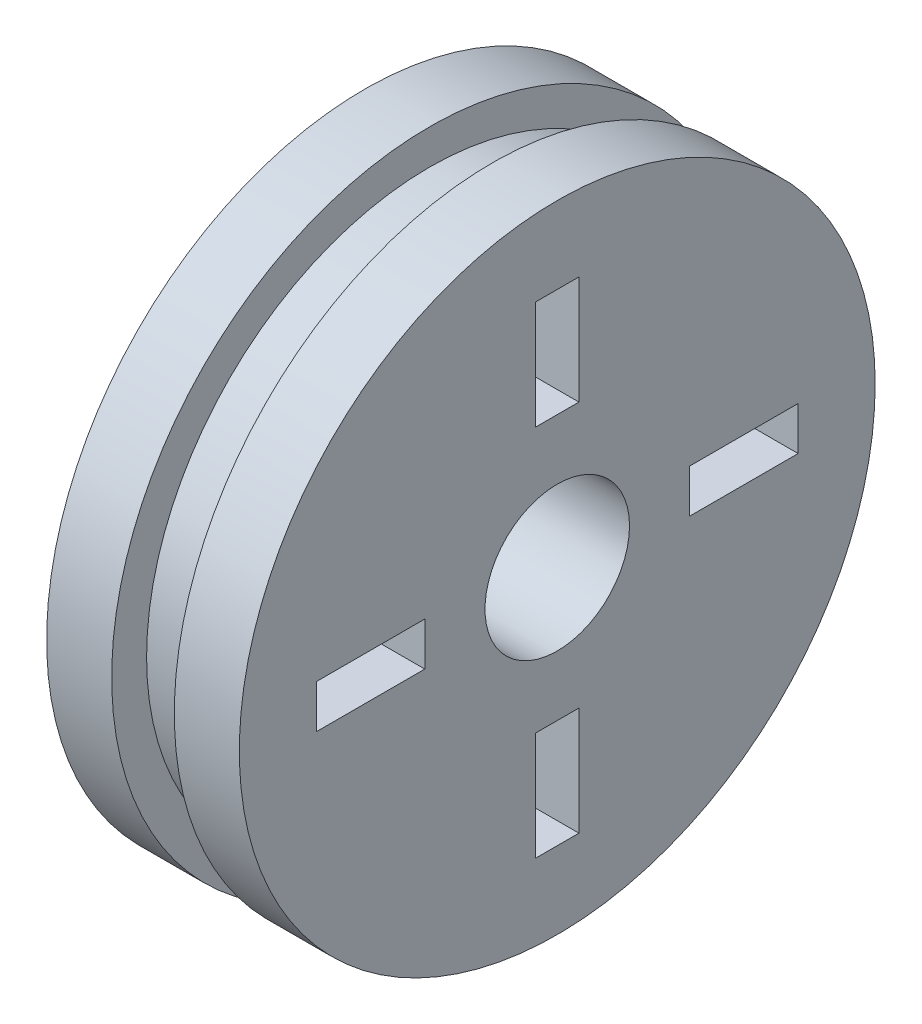
ISO-10303-21;
HEADER;
FILE_DESCRIPTION(('STEP AP214'),'2;1');
FILE_NAME('part.step','',(''),(''),'','','');
FILE_SCHEMA(('AUTOMOTIVE_DESIGN { 1 0 10303 214 1 1 1 1 }'));
ENDSEC;
DATA;
#1=APPLICATION_CONTEXT('core data for automotive mechanical design processes');
#2=APPLICATION_PROTOCOL_DEFINITION('international standard','automotive_design',2000,#1);
#3=PRODUCT_CONTEXT('',#1,'mechanical');
#4=PRODUCT('Part','Part','',(#3));
#5=PRODUCT_RELATED_PRODUCT_CATEGORY('part','',(#4));
#6=PRODUCT_DEFINITION_FORMATION('','',#4);
#7=PRODUCT_DEFINITION_CONTEXT('part definition',#1,'design');
#8=PRODUCT_DEFINITION('design','',#6,#7);
#9=PRODUCT_DEFINITION_SHAPE('','',#8);
#10=(LENGTH_UNIT() NAMED_UNIT(*) SI_UNIT(.MILLI.,.METRE.));
#11=(NAMED_UNIT(*) PLANE_ANGLE_UNIT() SI_UNIT($,.RADIAN.));
#12=(NAMED_UNIT(*) SI_UNIT($,.STERADIAN.) SOLID_ANGLE_UNIT());
#13=UNCERTAINTY_MEASURE_WITH_UNIT(LENGTH_MEASURE(1.E-05),#10,'distance_accuracy_value','');
#14=(GEOMETRIC_REPRESENTATION_CONTEXT(3) GLOBAL_UNCERTAINTY_ASSIGNED_CONTEXT((#13)) GLOBAL_UNIT_ASSIGNED_CONTEXT((#10,
#11,#12)) REPRESENTATION_CONTEXT('',''));
#15=CARTESIAN_POINT('',(0.,0.,0.));
#16=DIRECTION('',(0.,0.,1.));
#17=DIRECTION('',(1.,0.,0.));
#18=AXIS2_PLACEMENT_3D('',#15,#16,#17);
#19=CARTESIAN_POINT('',(85.2,-65.,66.));
#20=DIRECTION('',(1.,0.,0.));
#21=DIRECTION('',(0.,0.,-1.));
#22=AXIS2_PLACEMENT_3D('',#19,#20,#21);
#23=PLANE('',#22);
#24=CARTESIAN_POINT('',(85.2,-65.,66.));
#25=DIRECTION('',(1.,0.,0.));
#26=DIRECTION('',(0.,0.,-1.));
#27=AXIS2_PLACEMENT_3D('',#24,#25,#26);
#28=CIRCLE('',#27,3.);
#29=CARTESIAN_POINT('',(85.2,-65.,63.));
#30=VERTEX_POINT('',#29);
#31=EDGE_CURVE('E936',#30,#30,#28,.F.);
#32=ORIENTED_EDGE('',*,*,#31,.T.);
#33=EDGE_LOOP('',(#32));
#34=FACE_BOUND('',#33,.T.);
#35=CARTESIAN_POINT('',(85.2,-65.,66.));
#36=DIRECTION('',(1.,0.,0.));
#37=DIRECTION('',(0.,0.,-1.));
#38=AXIS2_PLACEMENT_3D('',#35,#36,#37);
#39=CIRCLE('',#38,13.2);
#40=CARTESIAN_POINT('',(85.2,-65.,52.8));
#41=VERTEX_POINT('',#40);
#42=EDGE_CURVE('E386',#41,#41,#39,.T.);
#43=ORIENTED_EDGE('',*,*,#42,.T.);
#44=EDGE_LOOP('',(#43));
#45=FACE_BOUND('',#44,.T.);
#46=DIRECTION('',(0.,0.,1.));
#47=VECTOR('',#46,1.);
#48=CARTESIAN_POINT('',(85.2,-59.5,66.));
#49=LINE('',#48,#47);
#50=CARTESIAN_POINT('',(85.2,-59.5,65.1));
#51=VERTEX_POINT('',#50);
#52=CARTESIAN_POINT('',(85.2,-59.5,66.9));
#53=VERTEX_POINT('',#52);
#54=EDGE_CURVE('E363',#51,#53,#49,.T.);
#55=ORIENTED_EDGE('',*,*,#54,.T.);
#56=DIRECTION('',(0.,1.,0.));
#57=VECTOR('',#56,1.);
#58=CARTESIAN_POINT('',(85.2,-65.,66.9));
#59=LINE('',#58,#57);
#60=CARTESIAN_POINT('',(85.2,-55.,66.9));
#61=VERTEX_POINT('',#60);
#62=EDGE_CURVE('E357',#53,#61,#59,.T.);
#63=ORIENTED_EDGE('',*,*,#62,.T.);
#64=DIRECTION('',(0.,0.,-1.));
#65=VECTOR('',#64,1.);
#66=CARTESIAN_POINT('',(85.2,-55.,66.));
#67=LINE('',#66,#65);
#68=CARTESIAN_POINT('',(85.2,-55.,65.1));
#69=VERTEX_POINT('',#68);
#70=EDGE_CURVE('E360',#61,#69,#67,.T.);
#71=ORIENTED_EDGE('',*,*,#70,.T.);
#72=DIRECTION('',(0.,1.,0.));
#73=VECTOR('',#72,1.);
#74=CARTESIAN_POINT('',(85.2,-65.,65.1));
#75=LINE('',#74,#73);
#76=EDGE_CURVE('E353',#51,#69,#75,.T.);
#77=ORIENTED_EDGE('',*,*,#76,.F.);
#78=EDGE_LOOP('',(#55,#63,#71,#77));
#79=FACE_BOUND('',#78,.T.);
#80=DIRECTION('',(0.,0.,1.));
#81=VECTOR('',#80,1.);
#82=CARTESIAN_POINT('',(85.2,-75.,66.));
#83=LINE('',#82,#81);
#84=CARTESIAN_POINT('',(85.2,-75.,65.1));
#85=VERTEX_POINT('',#84);
#86=CARTESIAN_POINT('',(85.2,-75.,66.9));
#87=VERTEX_POINT('',#86);
#88=EDGE_CURVE('E323',#85,#87,#83,.T.);
#89=ORIENTED_EDGE('',*,*,#88,.T.);
#90=DIRECTION('',(0.,1.,0.));
#91=VECTOR('',#90,1.);
#92=CARTESIAN_POINT('',(85.2,-65.,66.9));
#93=LINE('',#92,#91);
#94=CARTESIAN_POINT('',(85.2,-70.5,66.9));
#95=VERTEX_POINT('',#94);
#96=EDGE_CURVE('E317',#87,#95,#93,.T.);
#97=ORIENTED_EDGE('',*,*,#96,.T.);
#98=DIRECTION('',(0.,0.,-1.));
#99=VECTOR('',#98,1.);
#100=CARTESIAN_POINT('',(85.2,-70.5,66.));
#101=LINE('',#100,#99);
#102=CARTESIAN_POINT('',(85.2,-70.5,65.1));
#103=VERTEX_POINT('',#102);
#104=EDGE_CURVE('E320',#95,#103,#101,.T.);
#105=ORIENTED_EDGE('',*,*,#104,.T.);
#106=DIRECTION('',(0.,1.,0.));
#107=VECTOR('',#106,1.);
#108=CARTESIAN_POINT('',(85.2,-65.,65.1));
#109=LINE('',#108,#107);
#110=EDGE_CURVE('E313',#85,#103,#109,.T.);
#111=ORIENTED_EDGE('',*,*,#110,.F.);
#112=EDGE_LOOP('',(#89,#97,#105,#111));
#113=FACE_BOUND('',#112,.T.);
#114=DIRECTION('',(0.,0.,1.));
#115=VECTOR('',#114,1.);
#116=CARTESIAN_POINT('',(85.2,-65.9,66.));
#117=LINE('',#116,#115);
#118=CARTESIAN_POINT('',(85.2,-65.9,71.5));
#119=VERTEX_POINT('',#118);
#120=CARTESIAN_POINT('',(85.2,-65.9,76.));
#121=VERTEX_POINT('',#120);
#122=EDGE_CURVE('E286',#119,#121,#117,.T.);
#123=ORIENTED_EDGE('',*,*,#122,.T.);
#124=DIRECTION('',(0.,1.,0.));
#125=VECTOR('',#124,1.);
#126=CARTESIAN_POINT('',(85.2,-65.,76.));
#127=LINE('',#126,#125);
#128=CARTESIAN_POINT('',(85.2,-64.1,76.));
#129=VERTEX_POINT('',#128);
#130=EDGE_CURVE('E280',#121,#129,#127,.T.);
#131=ORIENTED_EDGE('',*,*,#130,.T.);
#132=DIRECTION('',(0.,0.,-1.));
#133=VECTOR('',#132,1.);
#134=CARTESIAN_POINT('',(85.2,-64.1,66.));
#135=LINE('',#134,#133);
#136=CARTESIAN_POINT('',(85.2,-64.1,71.5));
#137=VERTEX_POINT('',#136);
#138=EDGE_CURVE('E283',#129,#137,#135,.T.);
#139=ORIENTED_EDGE('',*,*,#138,.T.);
#140=DIRECTION('',(0.,1.,0.));
#141=VECTOR('',#140,1.);
#142=CARTESIAN_POINT('',(85.2,-65.,71.5));
#143=LINE('',#142,#141);
#144=EDGE_CURVE('E276',#119,#137,#143,.T.);
#145=ORIENTED_EDGE('',*,*,#144,.F.);
#146=EDGE_LOOP('',(#123,#131,#139,#145));
#147=FACE_BOUND('',#146,.T.);
#148=DIRECTION('',(0.,0.,1.));
#149=VECTOR('',#148,1.);
#150=CARTESIAN_POINT('',(85.2,-65.9,66.));
#151=LINE('',#150,#149);
#152=CARTESIAN_POINT('',(85.2,-65.9,56.));
#153=VERTEX_POINT('',#152);
#154=CARTESIAN_POINT('',(85.2,-65.9,60.5));
#155=VERTEX_POINT('',#154);
#156=EDGE_CURVE('E246',#153,#155,#151,.T.);
#157=ORIENTED_EDGE('',*,*,#156,.T.);
#158=DIRECTION('',(0.,1.,0.));
#159=VECTOR('',#158,1.);
#160=CARTESIAN_POINT('',(85.2,-65.,60.5));
#161=LINE('',#160,#159);
#162=CARTESIAN_POINT('',(85.2,-64.1,60.5));
#163=VERTEX_POINT('',#162);
#164=EDGE_CURVE('E232',#155,#163,#161,.T.);
#165=ORIENTED_EDGE('',*,*,#164,.T.);
#166=DIRECTION('',(0.,0.,-1.));
#167=VECTOR('',#166,1.);
#168=CARTESIAN_POINT('',(85.2,-64.1,66.));
#169=LINE('',#168,#167);
#170=CARTESIAN_POINT('',(85.2,-64.1,56.));
#171=VERTEX_POINT('',#170);
#172=EDGE_CURVE('E238',#163,#171,#169,.T.);
#173=ORIENTED_EDGE('',*,*,#172,.T.);
#174=DIRECTION('',(0.,1.,0.));
#175=VECTOR('',#174,1.);
#176=CARTESIAN_POINT('',(85.2,-65.,56.));
#177=LINE('',#176,#175);
#178=EDGE_CURVE('E227',#153,#171,#177,.T.);
#179=ORIENTED_EDGE('',*,*,#178,.F.);
#180=EDGE_LOOP('',(#157,#165,#173,#179));
#181=FACE_BOUND('',#180,.T.);
#182=ADVANCED_FACE('F45',(#34,#45,#79,#113,#147,#181),#23,.T.);
#183=CARTESIAN_POINT('',(79.,-65.,66.));
#184=DIRECTION('',(1.,0.,0.));
#185=DIRECTION('',(0.,0.,-1.));
#186=AXIS2_PLACEMENT_3D('',#183,#184,#185);
#187=PLANE('',#186);
#188=CARTESIAN_POINT('',(79.,-65.,66.));
#189=DIRECTION('',(1.,0.,0.));
#190=DIRECTION('',(0.,0.,-1.));
#191=AXIS2_PLACEMENT_3D('',#188,#189,#190);
#192=CIRCLE('',#191,3.);
#193=CARTESIAN_POINT('',(79.,-65.,63.));
#194=VERTEX_POINT('',#193);
#195=EDGE_CURVE('E49',#194,#194,#192,.F.);
#196=ORIENTED_EDGE('',*,*,#195,.F.);
#197=EDGE_LOOP('',(#196));
#198=FACE_BOUND('',#197,.T.);
#199=DIRECTION('',(0.,1.,0.));
#200=VECTOR('',#199,1.);
#201=CARTESIAN_POINT('',(79.,-65.,66.9));
#202=LINE('',#201,#200);
#203=CARTESIAN_POINT('',(79.,-59.5,66.9));
#204=VERTEX_POINT('',#203);
#205=CARTESIAN_POINT('',(79.,-55.,66.9));
#206=VERTEX_POINT('',#205);
#207=EDGE_CURVE('E412',#204,#206,#202,.T.);
#208=ORIENTED_EDGE('',*,*,#207,.F.);
#209=DIRECTION('',(0.,0.,1.));
#210=VECTOR('',#209,1.);
#211=CARTESIAN_POINT('',(79.,-59.5,66.));
#212=LINE('',#211,#210);
#213=CARTESIAN_POINT('',(79.,-59.5,65.1));
#214=VERTEX_POINT('',#213);
#215=EDGE_CURVE('E410',#214,#204,#212,.T.);
#216=ORIENTED_EDGE('',*,*,#215,.F.);
#217=DIRECTION('',(0.,1.,0.));
#218=VECTOR('',#217,1.);
#219=CARTESIAN_POINT('',(79.,-65.,65.1));
#220=LINE('',#219,#218);
#221=CARTESIAN_POINT('',(79.,-55.,65.1));
#222=VERTEX_POINT('',#221);
#223=EDGE_CURVE('E404',#214,#222,#220,.T.);
#224=ORIENTED_EDGE('',*,*,#223,.T.);
#225=DIRECTION('',(0.,0.,-1.));
#226=VECTOR('',#225,1.);
#227=CARTESIAN_POINT('',(79.,-55.,66.));
#228=LINE('',#227,#226);
#229=EDGE_CURVE('E407',#206,#222,#228,.T.);
#230=ORIENTED_EDGE('',*,*,#229,.F.);
#231=EDGE_LOOP('',(#208,#216,#224,#230));
#232=FACE_BOUND('',#231,.T.);
#233=DIRECTION('',(0.,1.,0.));
#234=VECTOR('',#233,1.);
#235=CARTESIAN_POINT('',(79.,-65.,66.9));
#236=LINE('',#235,#234);
#237=CARTESIAN_POINT('',(79.,-75.,66.9));
#238=VERTEX_POINT('',#237);
#239=CARTESIAN_POINT('',(79.,-70.5,66.9));
#240=VERTEX_POINT('',#239);
#241=EDGE_CURVE('E424',#238,#240,#236,.T.);
#242=ORIENTED_EDGE('',*,*,#241,.F.);
#243=DIRECTION('',(0.,0.,1.));
#244=VECTOR('',#243,1.);
#245=CARTESIAN_POINT('',(79.,-75.,66.));
#246=LINE('',#245,#244);
#247=CARTESIAN_POINT('',(79.,-75.,65.1));
#248=VERTEX_POINT('',#247);
#249=EDGE_CURVE('E422',#248,#238,#246,.T.);
#250=ORIENTED_EDGE('',*,*,#249,.F.);
#251=DIRECTION('',(0.,1.,0.));
#252=VECTOR('',#251,1.);
#253=CARTESIAN_POINT('',(79.,-65.,65.1));
#254=LINE('',#253,#252);
#255=CARTESIAN_POINT('',(79.,-70.5,65.1));
#256=VERTEX_POINT('',#255);
#257=EDGE_CURVE('E416',#248,#256,#254,.T.);
#258=ORIENTED_EDGE('',*,*,#257,.T.);
#259=DIRECTION('',(0.,0.,-1.));
#260=VECTOR('',#259,1.);
#261=CARTESIAN_POINT('',(79.,-70.5,66.));
#262=LINE('',#261,#260);
#263=EDGE_CURVE('E419',#240,#256,#262,.T.);
#264=ORIENTED_EDGE('',*,*,#263,.F.);
#265=EDGE_LOOP('',(#242,#250,#258,#264));
#266=FACE_BOUND('',#265,.T.);
#267=DIRECTION('',(0.,1.,0.));
#268=VECTOR('',#267,1.);
#269=CARTESIAN_POINT('',(79.,-65.,76.));
#270=LINE('',#269,#268);
#271=CARTESIAN_POINT('',(79.,-65.9,76.));
#272=VERTEX_POINT('',#271);
#273=CARTESIAN_POINT('',(79.,-64.1,76.));
#274=VERTEX_POINT('',#273);
#275=EDGE_CURVE('E442',#272,#274,#270,.T.);
#276=ORIENTED_EDGE('',*,*,#275,.F.);
#277=DIRECTION('',(0.,0.,1.));
#278=VECTOR('',#277,1.);
#279=CARTESIAN_POINT('',(79.,-65.9,66.));
#280=LINE('',#279,#278);
#281=CARTESIAN_POINT('',(79.,-65.9,71.5));
#282=VERTEX_POINT('',#281);
#283=EDGE_CURVE('E440',#282,#272,#280,.T.);
#284=ORIENTED_EDGE('',*,*,#283,.F.);
#285=DIRECTION('',(0.,1.,0.));
#286=VECTOR('',#285,1.);
#287=CARTESIAN_POINT('',(79.,-65.,71.5));
#288=LINE('',#287,#286);
#289=CARTESIAN_POINT('',(79.,-64.1,71.5));
#290=VERTEX_POINT('',#289);
#291=EDGE_CURVE('E434',#282,#290,#288,.T.);
#292=ORIENTED_EDGE('',*,*,#291,.T.);
#293=DIRECTION('',(0.,0.,-1.));
#294=VECTOR('',#293,1.);
#295=CARTESIAN_POINT('',(79.,-64.1,66.));
#296=LINE('',#295,#294);
#297=EDGE_CURVE('E437',#274,#290,#296,.T.);
#298=ORIENTED_EDGE('',*,*,#297,.F.);
#299=EDGE_LOOP('',(#276,#284,#292,#298));
#300=FACE_BOUND('',#299,.T.);
#301=DIRECTION('',(0.,1.,0.));
#302=VECTOR('',#301,1.);
#303=CARTESIAN_POINT('',(79.,-65.,62.7));
#304=LINE('',#303,#302);
#305=CARTESIAN_POINT('',(79.,-61.7,62.7));
#306=VERTEX_POINT('',#305);
#307=CARTESIAN_POINT('',(79.,-53.5,62.7));
#308=VERTEX_POINT('',#307);
#309=EDGE_CURVE('E366',#306,#308,#304,.T.);
#310=ORIENTED_EDGE('',*,*,#309,.F.);
#311=DIRECTION('',(0.,0.,-1.));
#312=VECTOR('',#311,1.);
#313=CARTESIAN_POINT('',(79.,-61.7,66.));
#314=LINE('',#313,#312);
#315=CARTESIAN_POINT('',(79.,-61.7,54.5));
#316=VERTEX_POINT('',#315);
#317=EDGE_CURVE('E259',#306,#316,#314,.T.);
#318=ORIENTED_EDGE('',*,*,#317,.T.);
#319=DIRECTION('',(0.,1.,0.));
#320=VECTOR('',#319,1.);
#321=CARTESIAN_POINT('',(79.,-68.3,54.5));
#322=LINE('',#321,#320);
#323=CARTESIAN_POINT('',(79.,-68.3,54.5));
#324=VERTEX_POINT('',#323);
#325=EDGE_CURVE('E253',#324,#316,#322,.T.);
#326=ORIENTED_EDGE('',*,*,#325,.F.);
#327=DIRECTION('',(0.,0.,-1.));
#328=VECTOR('',#327,1.);
#329=CARTESIAN_POINT('',(79.,-68.3,66.));
#330=LINE('',#329,#328);
#331=CARTESIAN_POINT('',(79.,-68.3,62.7));
#332=VERTEX_POINT('',#331);
#333=EDGE_CURVE('E261',#332,#324,#330,.T.);
#334=ORIENTED_EDGE('',*,*,#333,.F.);
#335=DIRECTION('',(0.,1.,0.));
#336=VECTOR('',#335,1.);
#337=CARTESIAN_POINT('',(79.,-76.5,62.7));
#338=LINE('',#337,#336);
#339=CARTESIAN_POINT('',(79.,-76.5,62.7));
#340=VERTEX_POINT('',#339);
#341=EDGE_CURVE('E330',#340,#332,#338,.T.);
#342=ORIENTED_EDGE('',*,*,#341,.F.);
#343=DIRECTION('',(0.,0.,-1.));
#344=VECTOR('',#343,1.);
#345=CARTESIAN_POINT('',(79.,-76.5,69.3));
#346=LINE('',#345,#344);
#347=CARTESIAN_POINT('',(79.,-76.5,69.3));
#348=VERTEX_POINT('',#347);
#349=EDGE_CURVE('E333',#348,#340,#346,.T.);
#350=ORIENTED_EDGE('',*,*,#349,.F.);
#351=DIRECTION('',(0.,1.,0.));
#352=VECTOR('',#351,1.);
#353=CARTESIAN_POINT('',(79.,-76.5,69.3));
#354=LINE('',#353,#352);
#355=CARTESIAN_POINT('',(79.,-68.3,69.3));
#356=VERTEX_POINT('',#355);
#357=EDGE_CURVE('E329',#348,#356,#354,.T.);
#358=ORIENTED_EDGE('',*,*,#357,.T.);
#359=DIRECTION('',(0.,0.,-1.));
#360=VECTOR('',#359,1.);
#361=CARTESIAN_POINT('',(79.,-68.3,77.5));
#362=LINE('',#361,#360);
#363=CARTESIAN_POINT('',(79.,-68.3,77.5));
#364=VERTEX_POINT('',#363);
#365=EDGE_CURVE('E299',#364,#356,#362,.T.);
#366=ORIENTED_EDGE('',*,*,#365,.F.);
#367=DIRECTION('',(0.,1.,0.));
#368=VECTOR('',#367,1.);
#369=CARTESIAN_POINT('',(79.,-68.3,77.5));
#370=LINE('',#369,#368);
#371=CARTESIAN_POINT('',(79.,-61.7,77.5));
#372=VERTEX_POINT('',#371);
#373=EDGE_CURVE('E291',#364,#372,#370,.T.);
#374=ORIENTED_EDGE('',*,*,#373,.T.);
#375=DIRECTION('',(0.,0.,-1.));
#376=VECTOR('',#375,1.);
#377=CARTESIAN_POINT('',(79.,-61.7,77.5));
#378=LINE('',#377,#376);
#379=CARTESIAN_POINT('',(79.,-61.7,69.3));
#380=VERTEX_POINT('',#379);
#381=EDGE_CURVE('E296',#372,#380,#378,.T.);
#382=ORIENTED_EDGE('',*,*,#381,.T.);
#383=DIRECTION('',(0.,1.,0.));
#384=VECTOR('',#383,1.);
#385=CARTESIAN_POINT('',(79.,-65.,69.3));
#386=LINE('',#385,#384);
#387=CARTESIAN_POINT('',(79.,-53.5,69.3));
#388=VERTEX_POINT('',#387);
#389=EDGE_CURVE('E367',#380,#388,#386,.T.);
#390=ORIENTED_EDGE('',*,*,#389,.T.);
#391=DIRECTION('',(0.,0.,-1.));
#392=VECTOR('',#391,1.);
#393=CARTESIAN_POINT('',(79.,-53.5,69.3));
#394=LINE('',#393,#392);
#395=EDGE_CURVE('E373',#388,#308,#394,.T.);
#396=ORIENTED_EDGE('',*,*,#395,.T.);
#397=EDGE_LOOP('',(#310,#318,#326,#334,#342,#350,#358,#366,#374,#382,#390,#396));
#398=FACE_BOUND('',#397,.T.);
#399=DIRECTION('',(0.,1.,0.));
#400=VECTOR('',#399,1.);
#401=CARTESIAN_POINT('',(79.,-65.,60.5));
#402=LINE('',#401,#400);
#403=CARTESIAN_POINT('',(79.,-65.9,60.5));
#404=VERTEX_POINT('',#403);
#405=CARTESIAN_POINT('',(79.,-64.1,60.5));
#406=VERTEX_POINT('',#405);
#407=EDGE_CURVE('E11',#404,#406,#402,.T.);
#408=ORIENTED_EDGE('',*,*,#407,.F.);
#409=DIRECTION('',(0.,0.,1.));
#410=VECTOR('',#409,1.);
#411=CARTESIAN_POINT('',(79.,-65.9,66.));
#412=LINE('',#411,#410);
#413=CARTESIAN_POINT('',(79.,-65.9,56.));
#414=VERTEX_POINT('',#413);
#415=EDGE_CURVE('E54',#414,#404,#412,.T.);
#416=ORIENTED_EDGE('',*,*,#415,.F.);
#417=DIRECTION('',(0.,1.,0.));
#418=VECTOR('',#417,1.);
#419=CARTESIAN_POINT('',(79.,-65.,56.));
#420=LINE('',#419,#418);
#421=CARTESIAN_POINT('',(79.,-64.1,56.));
#422=VERTEX_POINT('',#421);
#423=EDGE_CURVE('E452',#414,#422,#420,.T.);
#424=ORIENTED_EDGE('',*,*,#423,.T.);
#425=DIRECTION('',(0.,0.,-1.));
#426=VECTOR('',#425,1.);
#427=CARTESIAN_POINT('',(79.,-64.1,66.));
#428=LINE('',#427,#426);
#429=EDGE_CURVE('E241',#406,#422,#428,.T.);
#430=ORIENTED_EDGE('',*,*,#429,.F.);
#431=EDGE_LOOP('',(#408,#416,#424,#430));
#432=FACE_BOUND('',#431,.T.);
#433=ADVANCED_FACE('F465',(#198,#232,#266,#300,#398,#432),#187,.F.);
#434=CARTESIAN_POINT('',(77.2,-65.,66.));
#435=DIRECTION('',(1.,0.,0.));
#436=DIRECTION('',(0.,0.,-1.));
#437=AXIS2_PLACEMENT_3D('',#434,#435,#436);
#438=PLANE('',#437);
#439=CARTESIAN_POINT('',(77.2,-65.,66.));
#440=DIRECTION('',(1.,0.,0.));
#441=DIRECTION('',(0.,0.,-1.));
#442=AXIS2_PLACEMENT_3D('',#439,#440,#441);
#443=CIRCLE('',#442,13.2);
#444=CARTESIAN_POINT('',(77.2,-65.,52.8));
#445=VERTEX_POINT('',#444);
#446=EDGE_CURVE('E397',#445,#445,#443,.T.);
#447=ORIENTED_EDGE('',*,*,#446,.F.);
#448=EDGE_LOOP('',(#447));
#449=FACE_BOUND('',#448,.T.);
#450=DIRECTION('',(0.,0.,1.));
#451=VECTOR('',#450,1.);
#452=CARTESIAN_POINT('',(77.2,-68.3,66.));
#453=LINE('',#452,#451);
#454=CARTESIAN_POINT('',(77.2,-68.3,54.5));
#455=VERTEX_POINT('',#454);
#456=CARTESIAN_POINT('',(77.2,-68.3,62.7));
#457=VERTEX_POINT('',#456);
#458=EDGE_CURVE('E264',#455,#457,#453,.T.);
#459=ORIENTED_EDGE('',*,*,#458,.F.);
#460=DIRECTION('',(0.,1.,0.));
#461=VECTOR('',#460,1.);
#462=CARTESIAN_POINT('',(77.2,-65.,54.5));
#463=LINE('',#462,#461);
#464=CARTESIAN_POINT('',(77.2,-61.7,54.5));
#465=VERTEX_POINT('',#464);
#466=EDGE_CURVE('E449',#455,#465,#463,.T.);
#467=ORIENTED_EDGE('',*,*,#466,.T.);
#468=DIRECTION('',(0.,0.,-1.));
#469=VECTOR('',#468,1.);
#470=CARTESIAN_POINT('',(77.2,-61.7,66.));
#471=LINE('',#470,#469);
#472=CARTESIAN_POINT('',(77.2,-61.7,62.7));
#473=VERTEX_POINT('',#472);
#474=EDGE_CURVE('E266',#473,#465,#471,.T.);
#475=ORIENTED_EDGE('',*,*,#474,.F.);
#476=DIRECTION('',(0.,1.,0.));
#477=VECTOR('',#476,1.);
#478=CARTESIAN_POINT('',(77.2,-65.,62.7));
#479=LINE('',#478,#477);
#480=CARTESIAN_POINT('',(77.2,-53.5,62.7));
#481=VERTEX_POINT('',#480);
#482=EDGE_CURVE('E379',#473,#481,#479,.T.);
#483=ORIENTED_EDGE('',*,*,#482,.T.);
#484=DIRECTION('',(0.,0.,-1.));
#485=VECTOR('',#484,1.);
#486=CARTESIAN_POINT('',(77.2,-53.5,66.));
#487=LINE('',#486,#485);
#488=CARTESIAN_POINT('',(77.2,-53.5,69.3));
#489=VERTEX_POINT('',#488);
#490=EDGE_CURVE('E396',#489,#481,#487,.T.);
#491=ORIENTED_EDGE('',*,*,#490,.F.);
#492=DIRECTION('',(0.,1.,0.));
#493=VECTOR('',#492,1.);
#494=CARTESIAN_POINT('',(77.2,-65.,69.3));
#495=LINE('',#494,#493);
#496=CARTESIAN_POINT('',(77.2,-61.7,69.3));
#497=VERTEX_POINT('',#496);
#498=EDGE_CURVE('E381',#497,#489,#495,.T.);
#499=ORIENTED_EDGE('',*,*,#498,.F.);
#500=DIRECTION('',(0.,0.,-1.));
#501=VECTOR('',#500,1.);
#502=CARTESIAN_POINT('',(77.2,-61.7,66.));
#503=LINE('',#502,#501);
#504=CARTESIAN_POINT('',(77.2,-61.7,77.5));
#505=VERTEX_POINT('',#504);
#506=EDGE_CURVE('E303',#505,#497,#503,.T.);
#507=ORIENTED_EDGE('',*,*,#506,.F.);
#508=DIRECTION('',(0.,1.,0.));
#509=VECTOR('',#508,1.);
#510=CARTESIAN_POINT('',(77.2,-65.,77.5));
#511=LINE('',#510,#509);
#512=CARTESIAN_POINT('',(77.2,-68.3,77.5));
#513=VERTEX_POINT('',#512);
#514=EDGE_CURVE('E432',#513,#505,#511,.T.);
#515=ORIENTED_EDGE('',*,*,#514,.F.);
#516=DIRECTION('',(0.,0.,1.));
#517=VECTOR('',#516,1.);
#518=CARTESIAN_POINT('',(77.2,-68.3,66.));
#519=LINE('',#518,#517);
#520=CARTESIAN_POINT('',(77.2,-68.3,69.3));
#521=VERTEX_POINT('',#520);
#522=EDGE_CURVE('E301',#521,#513,#519,.T.);
#523=ORIENTED_EDGE('',*,*,#522,.F.);
#524=DIRECTION('',(0.,1.,0.));
#525=VECTOR('',#524,1.);
#526=CARTESIAN_POINT('',(77.2,-65.,69.3));
#527=LINE('',#526,#525);
#528=CARTESIAN_POINT('',(77.2,-76.5,69.3));
#529=VERTEX_POINT('',#528);
#530=EDGE_CURVE('E342',#529,#521,#527,.T.);
#531=ORIENTED_EDGE('',*,*,#530,.F.);
#532=DIRECTION('',(0.,0.,1.));
#533=VECTOR('',#532,1.);
#534=CARTESIAN_POINT('',(77.2,-76.5,66.));
#535=LINE('',#534,#533);
#536=CARTESIAN_POINT('',(77.2,-76.5,62.7));
#537=VERTEX_POINT('',#536);
#538=EDGE_CURVE('E414',#537,#529,#535,.T.);
#539=ORIENTED_EDGE('',*,*,#538,.F.);
#540=DIRECTION('',(0.,1.,0.));
#541=VECTOR('',#540,1.);
#542=CARTESIAN_POINT('',(77.2,-65.,62.7));
#543=LINE('',#542,#541);
#544=EDGE_CURVE('E339',#537,#457,#543,.T.);
#545=ORIENTED_EDGE('',*,*,#544,.T.);
#546=EDGE_LOOP('',(#459,#467,#475,#483,#491,#499,#507,#515,#523,#531,#539,#545));
#547=FACE_BOUND('',#546,.T.);
#548=ADVANCED_FACE('F467',(#449,#547),#438,.F.);
#549=CARTESIAN_POINT('',(0.,0.,62.7));
#550=DIRECTION('',(0.,0.,-1.));
#551=DIRECTION('',(-1.,0.,0.));
#552=AXIS2_PLACEMENT_3D('',#549,#550,#551);
#553=PLANE('',#552);
#554=DIRECTION('',(-1.,0.,0.));
#555=VECTOR('',#554,1.);
#556=CARTESIAN_POINT('',(0.,-61.7,62.7));
#557=LINE('',#556,#555);
#558=EDGE_CURVE('E447',#306,#473,#557,.T.);
#559=ORIENTED_EDGE('',*,*,#558,.F.);
#560=ORIENTED_EDGE('',*,*,#309,.T.);
#561=DIRECTION('',(-1.,0.,0.));
#562=VECTOR('',#561,1.);
#563=CARTESIAN_POINT('',(76.7,-53.5,62.7));
#564=LINE('',#563,#562);
#565=EDGE_CURVE('E370',#308,#481,#564,.T.);
#566=ORIENTED_EDGE('',*,*,#565,.T.);
#567=ORIENTED_EDGE('',*,*,#482,.F.);
#568=EDGE_LOOP('',(#559,#560,#566,#567));
#569=FACE_BOUND('',#568,.T.);
#570=ADVANCED_FACE('F474',(#569),#553,.F.);
#571=CARTESIAN_POINT('',(0.,0.,62.7));
#572=DIRECTION('',(0.,0.,-1.));
#573=DIRECTION('',(-1.,0.,0.));
#574=AXIS2_PLACEMENT_3D('',#571,#572,#573);
#575=PLANE('',#574);
#576=DIRECTION('',(1.,0.,0.));
#577=VECTOR('',#576,1.);
#578=CARTESIAN_POINT('',(0.,-68.3,62.7));
#579=LINE('',#578,#577);
#580=EDGE_CURVE('E444',#457,#332,#579,.T.);
#581=ORIENTED_EDGE('',*,*,#580,.F.);
#582=ORIENTED_EDGE('',*,*,#544,.F.);
#583=DIRECTION('',(1.,0.,0.));
#584=VECTOR('',#583,1.);
#585=CARTESIAN_POINT('',(76.7,-76.5,62.7));
#586=LINE('',#585,#584);
#587=EDGE_CURVE('E326',#537,#340,#586,.T.);
#588=ORIENTED_EDGE('',*,*,#587,.T.);
#589=ORIENTED_EDGE('',*,*,#341,.T.);
#590=EDGE_LOOP('',(#581,#582,#588,#589));
#591=FACE_BOUND('',#590,.T.);
#592=ADVANCED_FACE('F525',(#591),#575,.F.);
#593=CARTESIAN_POINT('',(0.,0.,69.3));
#594=DIRECTION('',(0.,0.,-1.));
#595=DIRECTION('',(-1.,0.,0.));
#596=AXIS2_PLACEMENT_3D('',#593,#594,#595);
#597=PLANE('',#596);
#598=ORIENTED_EDGE('',*,*,#389,.F.);
#599=DIRECTION('',(-1.,0.,0.));
#600=VECTOR('',#599,1.);
#601=CARTESIAN_POINT('',(0.,-61.7,69.3));
#602=LINE('',#601,#600);
#603=EDGE_CURVE('E429',#380,#497,#602,.T.);
#604=ORIENTED_EDGE('',*,*,#603,.T.);
#605=ORIENTED_EDGE('',*,*,#498,.T.);
#606=DIRECTION('',(-1.,0.,0.));
#607=VECTOR('',#606,1.);
#608=CARTESIAN_POINT('',(76.7,-53.5,69.3));
#609=LINE('',#608,#607);
#610=EDGE_CURVE('E369',#388,#489,#609,.T.);
#611=ORIENTED_EDGE('',*,*,#610,.F.);
#612=EDGE_LOOP('',(#598,#604,#605,#611));
#613=FACE_BOUND('',#612,.T.);
#614=ADVANCED_FACE('F512',(#613),#597,.T.);
#615=CARTESIAN_POINT('',(0.,0.,69.3));
#616=DIRECTION('',(0.,0.,-1.));
#617=DIRECTION('',(-1.,0.,0.));
#618=AXIS2_PLACEMENT_3D('',#615,#616,#617);
#619=PLANE('',#618);
#620=ORIENTED_EDGE('',*,*,#530,.T.);
#621=DIRECTION('',(1.,0.,0.));
#622=VECTOR('',#621,1.);
#623=CARTESIAN_POINT('',(0.,-68.3,69.3));
#624=LINE('',#623,#622);
#625=EDGE_CURVE('E426',#521,#356,#624,.T.);
#626=ORIENTED_EDGE('',*,*,#625,.T.);
#627=ORIENTED_EDGE('',*,*,#357,.F.);
#628=DIRECTION('',(1.,0.,0.));
#629=VECTOR('',#628,1.);
#630=CARTESIAN_POINT('',(76.7,-76.5,69.3));
#631=LINE('',#630,#629);
#632=EDGE_CURVE('E327',#529,#348,#631,.T.);
#633=ORIENTED_EDGE('',*,*,#632,.F.);
#634=EDGE_LOOP('',(#620,#626,#627,#633));
#635=FACE_BOUND('',#634,.T.);
#636=ADVANCED_FACE('F502',(#635),#619,.T.);
#637=CARTESIAN_POINT('',(85.2,-65.,66.));
#638=DIRECTION('',(-1.,0.,0.));
#639=DIRECTION('',(0.,0.,1.));
#640=AXIS2_PLACEMENT_3D('',#637,#638,#639);
#641=CYLINDRICAL_SURFACE('',#640,13.2);
#642=ORIENTED_EDGE('',*,*,#446,.T.);
#643=EDGE_LOOP('',(#642));
#644=FACE_BOUND('',#643,.T.);
#645=CARTESIAN_POINT('',(79.9,-65.,66.));
#646=DIRECTION('',(1.,0.,0.));
#647=DIRECTION('',(0.,0.,-1.));
#648=AXIS2_PLACEMENT_3D('',#645,#646,#647);
#649=CIRCLE('',#648,13.2);
#650=CARTESIAN_POINT('',(79.9,-65.,52.8));
#651=VERTEX_POINT('',#650);
#652=EDGE_CURVE('E392',#651,#651,#649,.T.);
#653=ORIENTED_EDGE('',*,*,#652,.F.);
#654=EDGE_LOOP('',(#653));
#655=FACE_BOUND('',#654,.T.);
#656=ADVANCED_FACE('F47',(#644,#655),#641,.T.);
#657=CARTESIAN_POINT('',(79.9,-65.,66.));
#658=DIRECTION('',(1.,0.,0.));
#659=DIRECTION('',(0.,0.,-1.));
#660=AXIS2_PLACEMENT_3D('',#657,#658,#659);
#661=PLANE('',#660);
#662=CARTESIAN_POINT('',(79.9,-65.,66.));
#663=DIRECTION('',(1.,0.,0.));
#664=DIRECTION('',(0.,0.,-1.));
#665=AXIS2_PLACEMENT_3D('',#662,#663,#664);
#666=CIRCLE('',#665,11.75);
#667=CARTESIAN_POINT('',(79.9,-65.,54.25));
#668=VERTEX_POINT('',#667);
#669=EDGE_CURVE('E393',#668,#668,#666,.T.);
#670=ORIENTED_EDGE('',*,*,#669,.F.);
#671=EDGE_LOOP('',(#670));
#672=FACE_BOUND('',#671,.T.);
#673=ORIENTED_EDGE('',*,*,#652,.T.);
#674=EDGE_LOOP('',(#673));
#675=FACE_BOUND('',#674,.T.);
#676=ADVANCED_FACE('F495',(#672,#675),#661,.T.);
#677=CARTESIAN_POINT('',(82.5,-65.,66.));
#678=DIRECTION('',(-1.,0.,0.));
#679=DIRECTION('',(0.,0.,1.));
#680=AXIS2_PLACEMENT_3D('',#677,#678,#679);
#681=CYLINDRICAL_SURFACE('',#680,11.75);
#682=CARTESIAN_POINT('',(82.5,-65.,66.));
#683=DIRECTION('',(1.,0.,0.));
#684=DIRECTION('',(0.,0.,-1.));
#685=AXIS2_PLACEMENT_3D('',#682,#683,#684);
#686=CIRCLE('',#685,11.75);
#687=CARTESIAN_POINT('',(82.5,-65.,54.25));
#688=VERTEX_POINT('',#687);
#689=EDGE_CURVE('E389',#688,#688,#686,.T.);
#690=ORIENTED_EDGE('',*,*,#689,.F.);
#691=EDGE_LOOP('',(#690));
#692=FACE_BOUND('',#691,.T.);
#693=ORIENTED_EDGE('',*,*,#669,.T.);
#694=EDGE_LOOP('',(#693));
#695=FACE_BOUND('',#694,.T.);
#696=ADVANCED_FACE('F491',(#692,#695),#681,.T.);
#697=CARTESIAN_POINT('',(85.2,-65.,66.));
#698=DIRECTION('',(-1.,0.,0.));
#699=DIRECTION('',(0.,0.,1.));
#700=AXIS2_PLACEMENT_3D('',#697,#698,#699);
#701=CYLINDRICAL_SURFACE('',#700,13.2);
#702=CARTESIAN_POINT('',(82.5,-65.,66.));
#703=DIRECTION('',(1.,0.,0.));
#704=DIRECTION('',(0.,0.,-1.));
#705=AXIS2_PLACEMENT_3D('',#702,#703,#704);
#706=CIRCLE('',#705,13.2);
#707=CARTESIAN_POINT('',(82.5,-65.,52.8));
#708=VERTEX_POINT('',#707);
#709=EDGE_CURVE('E383',#708,#708,#706,.T.);
#710=ORIENTED_EDGE('',*,*,#709,.T.);
#711=EDGE_LOOP('',(#710));
#712=FACE_BOUND('',#711,.T.);
#713=ORIENTED_EDGE('',*,*,#42,.F.);
#714=EDGE_LOOP('',(#713));
#715=FACE_BOUND('',#714,.T.);
#716=ADVANCED_FACE('F487',(#712,#715),#701,.T.);
#717=CARTESIAN_POINT('',(82.5,-65.,66.));
#718=DIRECTION('',(1.,0.,0.));
#719=DIRECTION('',(0.,0.,-1.));
#720=AXIS2_PLACEMENT_3D('',#717,#718,#719);
#721=PLANE('',#720);
#722=ORIENTED_EDGE('',*,*,#689,.T.);
#723=EDGE_LOOP('',(#722));
#724=FACE_BOUND('',#723,.T.);
#725=ORIENTED_EDGE('',*,*,#709,.F.);
#726=EDGE_LOOP('',(#725));
#727=FACE_BOUND('',#726,.T.);
#728=ADVANCED_FACE('F484',(#724,#727),#721,.F.);
#729=CARTESIAN_POINT('',(76.7,-53.5,69.3));
#730=DIRECTION('',(0.,-1.,0.));
#731=DIRECTION('',(0.,0.,-1.));
#732=AXIS2_PLACEMENT_3D('',#729,#730,#731);
#733=PLANE('',#732);
#734=ORIENTED_EDGE('',*,*,#490,.T.);
#735=ORIENTED_EDGE('',*,*,#565,.F.);
#736=ORIENTED_EDGE('',*,*,#395,.F.);
#737=ORIENTED_EDGE('',*,*,#610,.T.);
#738=EDGE_LOOP('',(#734,#735,#736,#737));
#739=FACE_BOUND('',#738,.T.);
#740=ADVANCED_FACE('F481',(#739),#733,.T.);
#741=CARTESIAN_POINT('',(76.2,-59.5,66.9));
#742=DIRECTION('',(0.,1.,0.));
#743=DIRECTION('',(0.,0.,1.));
#744=AXIS2_PLACEMENT_3D('',#741,#742,#743);
#745=PLANE('',#744);
#746=DIRECTION('',(1.,0.,0.));
#747=VECTOR('',#746,1.);
#748=CARTESIAN_POINT('',(76.2,-59.5,65.1));
#749=LINE('',#748,#747);
#750=EDGE_CURVE('E345',#214,#51,#749,.T.);
#751=ORIENTED_EDGE('',*,*,#750,.F.);
#752=ORIENTED_EDGE('',*,*,#215,.T.);
#753=DIRECTION('',(1.,0.,0.));
#754=VECTOR('',#753,1.);
#755=CARTESIAN_POINT('',(76.2,-59.5,66.9));
#756=LINE('',#755,#754);
#757=EDGE_CURVE('E346',#204,#53,#756,.T.);
#758=ORIENTED_EDGE('',*,*,#757,.T.);
#759=ORIENTED_EDGE('',*,*,#54,.F.);
#760=EDGE_LOOP('',(#751,#752,#758,#759));
#761=FACE_BOUND('',#760,.T.);
#762=ADVANCED_FACE('F589',(#761),#745,.T.);
#763=CARTESIAN_POINT('',(76.2,-55.,66.9));
#764=DIRECTION('',(0.,-1.,0.));
#765=DIRECTION('',(0.,0.,-1.));
#766=AXIS2_PLACEMENT_3D('',#763,#764,#765);
#767=PLANE('',#766);
#768=DIRECTION('',(-1.,0.,0.));
#769=VECTOR('',#768,1.);
#770=CARTESIAN_POINT('',(76.2,-55.,66.9));
#771=LINE('',#770,#769);
#772=EDGE_CURVE('E349',#61,#206,#771,.T.);
#773=ORIENTED_EDGE('',*,*,#772,.T.);
#774=ORIENTED_EDGE('',*,*,#229,.T.);
#775=DIRECTION('',(-1.,0.,0.));
#776=VECTOR('',#775,1.);
#777=CARTESIAN_POINT('',(76.2,-55.,65.1));
#778=LINE('',#777,#776);
#779=EDGE_CURVE('E350',#69,#222,#778,.T.);
#780=ORIENTED_EDGE('',*,*,#779,.F.);
#781=ORIENTED_EDGE('',*,*,#70,.F.);
#782=EDGE_LOOP('',(#773,#774,#780,#781));
#783=FACE_BOUND('',#782,.T.);
#784=ADVANCED_FACE('F584',(#783),#767,.T.);
#785=CARTESIAN_POINT('',(0.,0.,66.9));
#786=DIRECTION('',(0.,0.,-1.));
#787=DIRECTION('',(-1.,0.,0.));
#788=AXIS2_PLACEMENT_3D('',#785,#786,#787);
#789=PLANE('',#788);
#790=ORIENTED_EDGE('',*,*,#757,.F.);
#791=ORIENTED_EDGE('',*,*,#207,.T.);
#792=ORIENTED_EDGE('',*,*,#772,.F.);
#793=ORIENTED_EDGE('',*,*,#62,.F.);
#794=EDGE_LOOP('',(#790,#791,#792,#793));
#795=FACE_BOUND('',#794,.T.);
#796=ADVANCED_FACE('F578',(#795),#789,.T.);
#797=CARTESIAN_POINT('',(0.,0.,65.1));
#798=DIRECTION('',(0.,0.,-1.));
#799=DIRECTION('',(-1.,0.,0.));
#800=AXIS2_PLACEMENT_3D('',#797,#798,#799);
#801=PLANE('',#800);
#802=ORIENTED_EDGE('',*,*,#76,.T.);
#803=ORIENTED_EDGE('',*,*,#779,.T.);
#804=ORIENTED_EDGE('',*,*,#223,.F.);
#805=ORIENTED_EDGE('',*,*,#750,.T.);
#806=EDGE_LOOP('',(#802,#803,#804,#805));
#807=FACE_BOUND('',#806,.T.);
#808=ADVANCED_FACE('F568',(#807),#801,.F.);
#809=CARTESIAN_POINT('',(76.7,-76.5,69.3));
#810=DIRECTION('',(0.,1.,0.));
#811=DIRECTION('',(0.,0.,1.));
#812=AXIS2_PLACEMENT_3D('',#809,#810,#811);
#813=PLANE('',#812);
#814=ORIENTED_EDGE('',*,*,#538,.T.);
#815=ORIENTED_EDGE('',*,*,#632,.T.);
#816=ORIENTED_EDGE('',*,*,#349,.T.);
#817=ORIENTED_EDGE('',*,*,#587,.F.);
#818=EDGE_LOOP('',(#814,#815,#816,#817));
#819=FACE_BOUND('',#818,.T.);
#820=ADVANCED_FACE('F565',(#819),#813,.T.);
#821=CARTESIAN_POINT('',(76.2,-75.,66.9));
#822=DIRECTION('',(0.,1.,0.));
#823=DIRECTION('',(0.,0.,1.));
#824=AXIS2_PLACEMENT_3D('',#821,#822,#823);
#825=PLANE('',#824);
#826=DIRECTION('',(1.,0.,0.));
#827=VECTOR('',#826,1.);
#828=CARTESIAN_POINT('',(76.2,-75.,65.1));
#829=LINE('',#828,#827);
#830=EDGE_CURVE('E305',#248,#85,#829,.T.);
#831=ORIENTED_EDGE('',*,*,#830,.F.);
#832=ORIENTED_EDGE('',*,*,#249,.T.);
#833=DIRECTION('',(1.,0.,0.));
#834=VECTOR('',#833,1.);
#835=CARTESIAN_POINT('',(76.2,-75.,66.9));
#836=LINE('',#835,#834);
#837=EDGE_CURVE('E306',#238,#87,#836,.T.);
#838=ORIENTED_EDGE('',*,*,#837,.T.);
#839=ORIENTED_EDGE('',*,*,#88,.F.);
#840=EDGE_LOOP('',(#831,#832,#838,#839));
#841=FACE_BOUND('',#840,.T.);
#842=ADVANCED_FACE('F567',(#841),#825,.T.);
#843=CARTESIAN_POINT('',(76.2,-70.5,66.9));
#844=DIRECTION('',(0.,-1.,0.));
#845=DIRECTION('',(0.,0.,-1.));
#846=AXIS2_PLACEMENT_3D('',#843,#844,#845);
#847=PLANE('',#846);
#848=DIRECTION('',(-1.,0.,0.));
#849=VECTOR('',#848,1.);
#850=CARTESIAN_POINT('',(76.2,-70.5,66.9));
#851=LINE('',#850,#849);
#852=EDGE_CURVE('E309',#95,#240,#851,.T.);
#853=ORIENTED_EDGE('',*,*,#852,.T.);
#854=ORIENTED_EDGE('',*,*,#263,.T.);
#855=DIRECTION('',(-1.,0.,0.));
#856=VECTOR('',#855,1.);
#857=CARTESIAN_POINT('',(76.2,-70.5,65.1));
#858=LINE('',#857,#856);
#859=EDGE_CURVE('E310',#103,#256,#858,.T.);
#860=ORIENTED_EDGE('',*,*,#859,.F.);
#861=ORIENTED_EDGE('',*,*,#104,.F.);
#862=EDGE_LOOP('',(#853,#854,#860,#861));
#863=FACE_BOUND('',#862,.T.);
#864=ADVANCED_FACE('F574',(#863),#847,.T.);
#865=CARTESIAN_POINT('',(0.,0.,66.9));
#866=DIRECTION('',(0.,0.,-1.));
#867=DIRECTION('',(-1.,0.,0.));
#868=AXIS2_PLACEMENT_3D('',#865,#866,#867);
#869=PLANE('',#868);
#870=ORIENTED_EDGE('',*,*,#837,.F.);
#871=ORIENTED_EDGE('',*,*,#241,.T.);
#872=ORIENTED_EDGE('',*,*,#852,.F.);
#873=ORIENTED_EDGE('',*,*,#96,.F.);
#874=EDGE_LOOP('',(#870,#871,#872,#873));
#875=FACE_BOUND('',#874,.T.);
#876=ADVANCED_FACE('F615',(#875),#869,.T.);
#877=CARTESIAN_POINT('',(0.,0.,65.1));
#878=DIRECTION('',(0.,0.,-1.));
#879=DIRECTION('',(-1.,0.,0.));
#880=AXIS2_PLACEMENT_3D('',#877,#878,#879);
#881=PLANE('',#880);
#882=ORIENTED_EDGE('',*,*,#110,.T.);
#883=ORIENTED_EDGE('',*,*,#859,.T.);
#884=ORIENTED_EDGE('',*,*,#257,.F.);
#885=ORIENTED_EDGE('',*,*,#830,.T.);
#886=EDGE_LOOP('',(#882,#883,#884,#885));
#887=FACE_BOUND('',#886,.T.);
#888=ADVANCED_FACE('F654',(#887),#881,.F.);
#889=CARTESIAN_POINT('',(0.,0.,77.5));
#890=DIRECTION('',(0.,0.,-1.));
#891=DIRECTION('',(-1.,0.,0.));
#892=AXIS2_PLACEMENT_3D('',#889,#890,#891);
#893=PLANE('',#892);
#894=ORIENTED_EDGE('',*,*,#514,.T.);
#895=DIRECTION('',(-1.,0.,0.));
#896=VECTOR('',#895,1.);
#897=CARTESIAN_POINT('',(76.7,-61.7,77.5));
#898=LINE('',#897,#896);
#899=EDGE_CURVE('E293',#372,#505,#898,.T.);
#900=ORIENTED_EDGE('',*,*,#899,.F.);
#901=ORIENTED_EDGE('',*,*,#373,.F.);
#902=DIRECTION('',(1.,0.,0.));
#903=VECTOR('',#902,1.);
#904=CARTESIAN_POINT('',(76.7,-68.3,77.5));
#905=LINE('',#904,#903);
#906=EDGE_CURVE('E289',#513,#364,#905,.T.);
#907=ORIENTED_EDGE('',*,*,#906,.F.);
#908=EDGE_LOOP('',(#894,#900,#901,#907));
#909=FACE_BOUND('',#908,.T.);
#910=ADVANCED_FACE('F559',(#909),#893,.T.);
#911=CARTESIAN_POINT('',(76.7,-61.7,77.5));
#912=DIRECTION('',(0.,-1.,0.));
#913=DIRECTION('',(0.,0.,-1.));
#914=AXIS2_PLACEMENT_3D('',#911,#912,#913);
#915=PLANE('',#914);
#916=ORIENTED_EDGE('',*,*,#506,.T.);
#917=ORIENTED_EDGE('',*,*,#603,.F.);
#918=ORIENTED_EDGE('',*,*,#381,.F.);
#919=ORIENTED_EDGE('',*,*,#899,.T.);
#920=EDGE_LOOP('',(#916,#917,#918,#919));
#921=FACE_BOUND('',#920,.T.);
#922=ADVANCED_FACE('F553',(#921),#915,.T.);
#923=CARTESIAN_POINT('',(76.7,-68.3,77.5));
#924=DIRECTION('',(0.,1.,0.));
#925=DIRECTION('',(0.,0.,1.));
#926=AXIS2_PLACEMENT_3D('',#923,#924,#925);
#927=PLANE('',#926);
#928=ORIENTED_EDGE('',*,*,#522,.T.);
#929=ORIENTED_EDGE('',*,*,#906,.T.);
#930=ORIENTED_EDGE('',*,*,#365,.T.);
#931=ORIENTED_EDGE('',*,*,#625,.F.);
#932=EDGE_LOOP('',(#928,#929,#930,#931));
#933=FACE_BOUND('',#932,.T.);
#934=ADVANCED_FACE('F623',(#933),#927,.T.);
#935=CARTESIAN_POINT('',(76.2,-65.9,76.));
#936=DIRECTION('',(0.,1.,0.));
#937=DIRECTION('',(0.,0.,1.));
#938=AXIS2_PLACEMENT_3D('',#935,#936,#937);
#939=PLANE('',#938);
#940=DIRECTION('',(1.,0.,0.));
#941=VECTOR('',#940,1.);
#942=CARTESIAN_POINT('',(76.2,-65.9,71.5));
#943=LINE('',#942,#941);
#944=EDGE_CURVE('E268',#282,#119,#943,.T.);
#945=ORIENTED_EDGE('',*,*,#944,.F.);
#946=ORIENTED_EDGE('',*,*,#283,.T.);
#947=DIRECTION('',(1.,0.,0.));
#948=VECTOR('',#947,1.);
#949=CARTESIAN_POINT('',(76.2,-65.9,76.));
#950=LINE('',#949,#948);
#951=EDGE_CURVE('E269',#272,#121,#950,.T.);
#952=ORIENTED_EDGE('',*,*,#951,.T.);
#953=ORIENTED_EDGE('',*,*,#122,.F.);
#954=EDGE_LOOP('',(#945,#946,#952,#953));
#955=FACE_BOUND('',#954,.T.);
#956=ADVANCED_FACE('F626',(#955),#939,.T.);
#957=CARTESIAN_POINT('',(76.2,-64.1,76.));
#958=DIRECTION('',(0.,-1.,0.));
#959=DIRECTION('',(0.,0.,-1.));
#960=AXIS2_PLACEMENT_3D('',#957,#958,#959);
#961=PLANE('',#960);
#962=DIRECTION('',(-1.,0.,0.));
#963=VECTOR('',#962,1.);
#964=CARTESIAN_POINT('',(76.2,-64.1,76.));
#965=LINE('',#964,#963);
#966=EDGE_CURVE('E272',#129,#274,#965,.T.);
#967=ORIENTED_EDGE('',*,*,#966,.T.);
#968=ORIENTED_EDGE('',*,*,#297,.T.);
#969=DIRECTION('',(-1.,0.,0.));
#970=VECTOR('',#969,1.);
#971=CARTESIAN_POINT('',(76.2,-64.1,71.5));
#972=LINE('',#971,#970);
#973=EDGE_CURVE('E273',#137,#290,#972,.T.);
#974=ORIENTED_EDGE('',*,*,#973,.F.);
#975=ORIENTED_EDGE('',*,*,#138,.F.);
#976=EDGE_LOOP('',(#967,#968,#974,#975));
#977=FACE_BOUND('',#976,.T.);
#978=ADVANCED_FACE('F636',(#977),#961,.T.);
#979=CARTESIAN_POINT('',(0.,0.,76.));
#980=DIRECTION('',(0.,0.,-1.));
#981=DIRECTION('',(-1.,0.,0.));
#982=AXIS2_PLACEMENT_3D('',#979,#980,#981);
#983=PLANE('',#982);
#984=ORIENTED_EDGE('',*,*,#951,.F.);
#985=ORIENTED_EDGE('',*,*,#275,.T.);
#986=ORIENTED_EDGE('',*,*,#966,.F.);
#987=ORIENTED_EDGE('',*,*,#130,.F.);
#988=EDGE_LOOP('',(#984,#985,#986,#987));
#989=FACE_BOUND('',#988,.T.);
#990=ADVANCED_FACE('F680',(#989),#983,.T.);
#991=CARTESIAN_POINT('',(0.,0.,71.5));
#992=DIRECTION('',(0.,0.,-1.));
#993=DIRECTION('',(-1.,0.,0.));
#994=AXIS2_PLACEMENT_3D('',#991,#992,#993);
#995=PLANE('',#994);
#996=ORIENTED_EDGE('',*,*,#144,.T.);
#997=ORIENTED_EDGE('',*,*,#973,.T.);
#998=ORIENTED_EDGE('',*,*,#291,.F.);
#999=ORIENTED_EDGE('',*,*,#944,.T.);
#1000=EDGE_LOOP('',(#996,#997,#998,#999));
#1001=FACE_BOUND('',#1000,.T.);
#1002=ADVANCED_FACE('F690',(#1001),#995,.F.);
#1003=CARTESIAN_POINT('',(0.,0.,54.5));
#1004=DIRECTION('',(0.,0.,-1.));
#1005=DIRECTION('',(-1.,0.,0.));
#1006=AXIS2_PLACEMENT_3D('',#1003,#1004,#1005);
#1007=PLANE('',#1006);
#1008=DIRECTION('',(1.,0.,0.));
#1009=VECTOR('',#1008,1.);
#1010=CARTESIAN_POINT('',(76.7,-68.3,54.5));
#1011=LINE('',#1010,#1009);
#1012=EDGE_CURVE('E248',#455,#324,#1011,.T.);
#1013=ORIENTED_EDGE('',*,*,#1012,.T.);
#1014=ORIENTED_EDGE('',*,*,#325,.T.);
#1015=DIRECTION('',(-1.,0.,0.));
#1016=VECTOR('',#1015,1.);
#1017=CARTESIAN_POINT('',(76.7,-61.7,54.5));
#1018=LINE('',#1017,#1016);
#1019=EDGE_CURVE('E256',#316,#465,#1018,.T.);
#1020=ORIENTED_EDGE('',*,*,#1019,.T.);
#1021=ORIENTED_EDGE('',*,*,#466,.F.);
#1022=EDGE_LOOP('',(#1013,#1014,#1020,#1021));
#1023=FACE_BOUND('',#1022,.T.);
#1024=ADVANCED_FACE('F535',(#1023),#1007,.F.);
#1025=CARTESIAN_POINT('',(76.7,-61.7,66.));
#1026=DIRECTION('',(0.,-1.,0.));
#1027=DIRECTION('',(0.,0.,-1.));
#1028=AXIS2_PLACEMENT_3D('',#1025,#1026,#1027);
#1029=PLANE('',#1028);
#1030=ORIENTED_EDGE('',*,*,#474,.T.);
#1031=ORIENTED_EDGE('',*,*,#1019,.F.);
#1032=ORIENTED_EDGE('',*,*,#317,.F.);
#1033=ORIENTED_EDGE('',*,*,#558,.T.);
#1034=EDGE_LOOP('',(#1030,#1031,#1032,#1033));
#1035=FACE_BOUND('',#1034,.T.);
#1036=ADVANCED_FACE('F537',(#1035),#1029,.T.);
#1037=CARTESIAN_POINT('',(76.7,-68.3,66.));
#1038=DIRECTION('',(0.,1.,0.));
#1039=DIRECTION('',(0.,0.,1.));
#1040=AXIS2_PLACEMENT_3D('',#1037,#1038,#1039);
#1041=PLANE('',#1040);
#1042=ORIENTED_EDGE('',*,*,#458,.T.);
#1043=ORIENTED_EDGE('',*,*,#580,.T.);
#1044=ORIENTED_EDGE('',*,*,#333,.T.);
#1045=ORIENTED_EDGE('',*,*,#1012,.F.);
#1046=EDGE_LOOP('',(#1042,#1043,#1044,#1045));
#1047=FACE_BOUND('',#1046,.T.);
#1048=ADVANCED_FACE('F523',(#1047),#1041,.T.);
#1049=CARTESIAN_POINT('',(76.2,-65.9,60.5));
#1050=DIRECTION('',(0.,1.,0.));
#1051=DIRECTION('',(0.,0.,1.));
#1052=AXIS2_PLACEMENT_3D('',#1049,#1050,#1051);
#1053=PLANE('',#1052);
#1054=DIRECTION('',(1.,0.,0.));
#1055=VECTOR('',#1054,1.);
#1056=CARTESIAN_POINT('',(76.2,-65.9,56.));
#1057=LINE('',#1056,#1055);
#1058=EDGE_CURVE('E61',#414,#153,#1057,.T.);
#1059=ORIENTED_EDGE('',*,*,#1058,.F.);
#1060=ORIENTED_EDGE('',*,*,#415,.T.);
#1061=DIRECTION('',(1.,0.,0.));
#1062=VECTOR('',#1061,1.);
#1063=CARTESIAN_POINT('',(76.2,-65.9,60.5));
#1064=LINE('',#1063,#1062);
#1065=EDGE_CURVE('E243',#404,#155,#1064,.T.);
#1066=ORIENTED_EDGE('',*,*,#1065,.T.);
#1067=ORIENTED_EDGE('',*,*,#156,.F.);
#1068=EDGE_LOOP('',(#1059,#1060,#1066,#1067));
#1069=FACE_BOUND('',#1068,.T.);
#1070=ADVANCED_FACE('F459',(#1069),#1053,.T.);
#1071=CARTESIAN_POINT('',(76.2,-64.1,60.5));
#1072=DIRECTION('',(0.,-1.,0.));
#1073=DIRECTION('',(0.,0.,-1.));
#1074=AXIS2_PLACEMENT_3D('',#1071,#1072,#1073);
#1075=PLANE('',#1074);
#1076=DIRECTION('',(-1.,0.,0.));
#1077=VECTOR('',#1076,1.);
#1078=CARTESIAN_POINT('',(76.2,-64.1,60.5));
#1079=LINE('',#1078,#1077);
#1080=EDGE_CURVE('E233',#163,#406,#1079,.T.);
#1081=ORIENTED_EDGE('',*,*,#1080,.T.);
#1082=ORIENTED_EDGE('',*,*,#429,.T.);
#1083=DIRECTION('',(-1.,0.,0.));
#1084=VECTOR('',#1083,1.);
#1085=CARTESIAN_POINT('',(76.2,-64.1,56.));
#1086=LINE('',#1085,#1084);
#1087=EDGE_CURVE('E66',#171,#422,#1086,.T.);
#1088=ORIENTED_EDGE('',*,*,#1087,.F.);
#1089=ORIENTED_EDGE('',*,*,#172,.F.);
#1090=EDGE_LOOP('',(#1081,#1082,#1088,#1089));
#1091=FACE_BOUND('',#1090,.T.);
#1092=ADVANCED_FACE('F237',(#1091),#1075,.T.);
#1093=CARTESIAN_POINT('',(0.,0.,60.5));
#1094=DIRECTION('',(0.,0.,-1.));
#1095=DIRECTION('',(-1.,0.,0.));
#1096=AXIS2_PLACEMENT_3D('',#1093,#1094,#1095);
#1097=PLANE('',#1096);
#1098=ORIENTED_EDGE('',*,*,#1065,.F.);
#1099=ORIENTED_EDGE('',*,*,#407,.T.);
#1100=ORIENTED_EDGE('',*,*,#1080,.F.);
#1101=ORIENTED_EDGE('',*,*,#164,.F.);
#1102=EDGE_LOOP('',(#1098,#1099,#1100,#1101));
#1103=FACE_BOUND('',#1102,.T.);
#1104=ADVANCED_FACE('F463',(#1103),#1097,.T.);
#1105=CARTESIAN_POINT('',(0.,0.,56.));
#1106=DIRECTION('',(0.,0.,-1.));
#1107=DIRECTION('',(-1.,0.,0.));
#1108=AXIS2_PLACEMENT_3D('',#1105,#1106,#1107);
#1109=PLANE('',#1108);
#1110=ORIENTED_EDGE('',*,*,#178,.T.);
#1111=ORIENTED_EDGE('',*,*,#1087,.T.);
#1112=ORIENTED_EDGE('',*,*,#423,.F.);
#1113=ORIENTED_EDGE('',*,*,#1058,.T.);
#1114=EDGE_LOOP('',(#1110,#1111,#1112,#1113));
#1115=FACE_BOUND('',#1114,.T.);
#1116=ADVANCED_FACE('F228',(#1115),#1109,.F.);
#1117=CARTESIAN_POINT('',(86.2,-65.,66.));
#1118=DIRECTION('',(-1.,0.,0.));
#1119=DIRECTION('',(0.,0.,1.));
#1120=AXIS2_PLACEMENT_3D('',#1117,#1118,#1119);
#1121=CYLINDRICAL_SURFACE('',#1120,3.);
#1122=ORIENTED_EDGE('',*,*,#31,.F.);
#1123=EDGE_LOOP('',(#1122));
#1124=FACE_BOUND('',#1123,.T.);
#1125=ORIENTED_EDGE('',*,*,#195,.T.);
#1126=EDGE_LOOP('',(#1125));
#1127=FACE_BOUND('',#1126,.T.);
#1128=ADVANCED_FACE('F756',(#1124,#1127),#1121,.F.);
#1129=CLOSED_SHELL('',(#182,#433,#548,#570,#592,#614,#636,#656,#676,#696,#716,#728,#740,#762,
#784,#796,#808,#820,#842,#864,#876,#888,#910,#922,#934,#956,#978,#990,#1002,#1024,#1036,#1048,
#1070,#1092,#1104,#1116,#1128));
#1130=MANIFOLD_SOLID_BREP('B2',#1129);
#1131=ADVANCED_BREP_SHAPE_REPRESENTATION('',(#18,#1130),#14);
#1132=SHAPE_DEFINITION_REPRESENTATION(#9,#1131);
ENDSEC;
END-ISO-10303-21;
